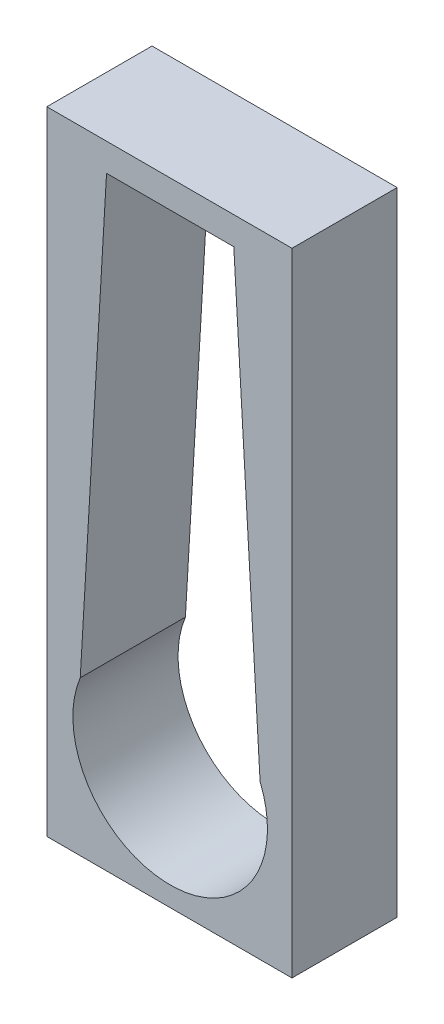
ISO-10303-21;
HEADER;
FILE_DESCRIPTION(('STEP AP214'),'2;1');
FILE_NAME('part.step','',(''),(''),'','','');
FILE_SCHEMA(('AUTOMOTIVE_DESIGN { 1 0 10303 214 1 1 1 1 }'));
ENDSEC;
DATA;
#1=APPLICATION_CONTEXT('core data for automotive mechanical design processes');
#2=APPLICATION_PROTOCOL_DEFINITION('international standard','automotive_design',2000,#1);
#3=PRODUCT_CONTEXT('',#1,'mechanical');
#4=PRODUCT('Part','Part','',(#3));
#5=PRODUCT_RELATED_PRODUCT_CATEGORY('part','',(#4));
#6=PRODUCT_DEFINITION_FORMATION('','',#4);
#7=PRODUCT_DEFINITION_CONTEXT('part definition',#1,'design');
#8=PRODUCT_DEFINITION('design','',#6,#7);
#9=PRODUCT_DEFINITION_SHAPE('','',#8);
#10=(LENGTH_UNIT() NAMED_UNIT(*) SI_UNIT(.MILLI.,.METRE.));
#11=(NAMED_UNIT(*) PLANE_ANGLE_UNIT() SI_UNIT($,.RADIAN.));
#12=(NAMED_UNIT(*) SI_UNIT($,.STERADIAN.) SOLID_ANGLE_UNIT());
#13=UNCERTAINTY_MEASURE_WITH_UNIT(LENGTH_MEASURE(1.E-05),#10,'distance_accuracy_value','');
#14=(GEOMETRIC_REPRESENTATION_CONTEXT(3) GLOBAL_UNCERTAINTY_ASSIGNED_CONTEXT((#13)) GLOBAL_UNIT_ASSIGNED_CONTEXT((#10,
#11,#12)) REPRESENTATION_CONTEXT('',''));
#15=CARTESIAN_POINT('',(0.,0.,0.));
#16=DIRECTION('',(0.,0.,1.));
#17=DIRECTION('',(1.,0.,0.));
#18=AXIS2_PLACEMENT_3D('',#15,#16,#17);
#19=CARTESIAN_POINT('',(0.,0.,4.));
#20=DIRECTION('',(0.,0.,-1.));
#21=DIRECTION('',(-1.,0.,0.));
#22=AXIS2_PLACEMENT_3D('',#19,#20,#21);
#23=PLANE('',#22);
#24=DIRECTION('',(0.,-1.,0.));
#25=VECTOR('',#24,1.);
#26=CARTESIAN_POINT('',(-4.69041686059611,-4.44856408303882,4.));
#27=LINE('',#26,#25);
#28=CARTESIAN_POINT('',(-4.69041686059611,19.587230154749,4.));
#29=VERTEX_POINT('',#28);
#30=CARTESIAN_POINT('',(-4.69041686059611,-4.44856408303882,4.));
#31=VERTEX_POINT('',#30);
#32=EDGE_CURVE('E159',#29,#31,#27,.T.);
#33=ORIENTED_EDGE('',*,*,#32,.T.);
#34=DIRECTION('',(1.,0.,0.));
#35=VECTOR('',#34,1.);
#36=CARTESIAN_POINT('',(-4.69041686059611,-4.44856408303882,4.));
#37=LINE('',#36,#35);
#38=CARTESIAN_POINT('',(4.63307627790522,-4.44856408303882,4.));
#39=VERTEX_POINT('',#38);
#40=EDGE_CURVE('E163',#31,#39,#37,.T.);
#41=ORIENTED_EDGE('',*,*,#40,.T.);
#42=DIRECTION('',(0.,1.,0.));
#43=VECTOR('',#42,1.);
#44=CARTESIAN_POINT('',(4.63307627790522,-4.44856408303882,4.));
#45=LINE('',#44,#43);
#46=CARTESIAN_POINT('',(4.63307627790522,19.587230154749,4.));
#47=VERTEX_POINT('',#46);
#48=EDGE_CURVE('E167',#39,#47,#45,.T.);
#49=ORIENTED_EDGE('',*,*,#48,.T.);
#50=DIRECTION('',(-1.,0.,0.));
#51=VECTOR('',#50,1.);
#52=CARTESIAN_POINT('',(-4.69041686059611,19.587230154749,4.));
#53=LINE('',#52,#51);
#54=EDGE_CURVE('E170',#47,#29,#53,.T.);
#55=ORIENTED_EDGE('',*,*,#54,.T.);
#56=EDGE_LOOP('',(#33,#41,#49,#55));
#57=FACE_BOUND('',#56,.T.);
#58=CARTESIAN_POINT('',(0.,0.,4.));
#59=DIRECTION('',(0.,0.,1.));
#60=DIRECTION('',(1.,0.,0.));
#61=AXIS2_PLACEMENT_3D('',#58,#59,#60);
#62=CIRCLE('',#61,3.7);
#63=CARTESIAN_POINT('',(-3.42,1.41194900757782,4.));
#64=VERTEX_POINT('',#63);
#65=CARTESIAN_POINT('',(3.42,1.41194900757782,4.));
#66=VERTEX_POINT('',#65);
#67=EDGE_CURVE('E111',#64,#66,#62,.T.);
#68=ORIENTED_EDGE('',*,*,#67,.F.);
#69=DIRECTION('',(-0.0583184400996108,-0.998298031423657,0.));
#70=VECTOR('',#69,1.);
#71=CARTESIAN_POINT('',(-2.42,18.53,4.));
#72=LINE('',#71,#70);
#73=CARTESIAN_POINT('',(-2.42,18.53,4.));
#74=VERTEX_POINT('',#73);
#75=EDGE_CURVE('E137',#74,#64,#72,.T.);
#76=ORIENTED_EDGE('',*,*,#75,.F.);
#77=DIRECTION('',(-1.,0.,0.));
#78=VECTOR('',#77,1.);
#79=CARTESIAN_POINT('',(2.42,18.53,4.));
#80=LINE('',#79,#78);
#81=CARTESIAN_POINT('',(2.42,18.53,4.));
#82=VERTEX_POINT('',#81);
#83=EDGE_CURVE('E133',#82,#74,#80,.T.);
#84=ORIENTED_EDGE('',*,*,#83,.F.);
#85=DIRECTION('',(-0.0583184400996108,0.998298031423657,0.));
#86=VECTOR('',#85,1.);
#87=CARTESIAN_POINT('',(3.42,1.41194900757782,4.));
#88=LINE('',#87,#86);
#89=EDGE_CURVE('E120',#66,#82,#88,.T.);
#90=ORIENTED_EDGE('',*,*,#89,.F.);
#91=EDGE_LOOP('',(#68,#76,#84,#90));
#92=FACE_BOUND('',#91,.T.);
#93=ADVANCED_FACE('F45',(#57,#92),#23,.F.);
#94=CARTESIAN_POINT('',(0.,0.,0.));
#95=DIRECTION('',(0.,0.,-1.));
#96=DIRECTION('',(-1.,0.,0.));
#97=AXIS2_PLACEMENT_3D('',#94,#95,#96);
#98=PLANE('',#97);
#99=DIRECTION('',(0.,-1.,0.));
#100=VECTOR('',#99,1.);
#101=CARTESIAN_POINT('',(-4.69041686059611,-4.44856408303882,0.));
#102=LINE('',#101,#100);
#103=CARTESIAN_POINT('',(-4.69041686059611,19.587230154749,0.));
#104=VERTEX_POINT('',#103);
#105=CARTESIAN_POINT('',(-4.69041686059611,-4.44856408303882,0.));
#106=VERTEX_POINT('',#105);
#107=EDGE_CURVE('E129',#104,#106,#102,.T.);
#108=ORIENTED_EDGE('',*,*,#107,.F.);
#109=DIRECTION('',(-1.,0.,0.));
#110=VECTOR('',#109,1.);
#111=CARTESIAN_POINT('',(-4.69041686059611,19.587230154749,0.));
#112=LINE('',#111,#110);
#113=CARTESIAN_POINT('',(4.63307627790522,19.587230154749,0.));
#114=VERTEX_POINT('',#113);
#115=EDGE_CURVE('E164',#114,#104,#112,.T.);
#116=ORIENTED_EDGE('',*,*,#115,.F.);
#117=DIRECTION('',(0.,1.,0.));
#118=VECTOR('',#117,1.);
#119=CARTESIAN_POINT('',(4.63307627790522,-4.44856408303882,0.));
#120=LINE('',#119,#118);
#121=CARTESIAN_POINT('',(4.63307627790522,-4.44856408303882,0.));
#122=VERTEX_POINT('',#121);
#123=EDGE_CURVE('E180',#122,#114,#120,.T.);
#124=ORIENTED_EDGE('',*,*,#123,.F.);
#125=DIRECTION('',(1.,0.,0.));
#126=VECTOR('',#125,1.);
#127=CARTESIAN_POINT('',(-4.69041686059611,-4.44856408303882,0.));
#128=LINE('',#127,#126);
#129=EDGE_CURVE('E177',#106,#122,#128,.T.);
#130=ORIENTED_EDGE('',*,*,#129,.F.);
#131=EDGE_LOOP('',(#108,#116,#124,#130));
#132=FACE_BOUND('',#131,.T.);
#133=DIRECTION('',(-0.0583184400996108,-0.998298031423657,0.));
#134=VECTOR('',#133,1.);
#135=CARTESIAN_POINT('',(-2.42,18.53,0.));
#136=LINE('',#135,#134);
#137=CARTESIAN_POINT('',(-2.42,18.53,0.));
#138=VERTEX_POINT('',#137);
#139=CARTESIAN_POINT('',(-3.42,1.41194900757782,0.));
#140=VERTEX_POINT('',#139);
#141=EDGE_CURVE('E121',#138,#140,#136,.T.);
#142=ORIENTED_EDGE('',*,*,#141,.T.);
#143=CARTESIAN_POINT('',(0.,0.,0.));
#144=DIRECTION('',(0.,0.,1.));
#145=DIRECTION('',(1.,0.,0.));
#146=AXIS2_PLACEMENT_3D('',#143,#144,#145);
#147=CIRCLE('',#146,3.7);
#148=CARTESIAN_POINT('',(3.42,1.41194900757782,0.));
#149=VERTEX_POINT('',#148);
#150=EDGE_CURVE('E69',#140,#149,#147,.T.);
#151=ORIENTED_EDGE('',*,*,#150,.T.);
#152=DIRECTION('',(-0.0583184400996108,0.998298031423657,0.));
#153=VECTOR('',#152,1.);
#154=CARTESIAN_POINT('',(3.42,1.41194900757782,0.));
#155=LINE('',#154,#153);
#156=CARTESIAN_POINT('',(2.42,18.53,0.));
#157=VERTEX_POINT('',#156);
#158=EDGE_CURVE('E127',#149,#157,#155,.T.);
#159=ORIENTED_EDGE('',*,*,#158,.T.);
#160=DIRECTION('',(-1.,0.,0.));
#161=VECTOR('',#160,1.);
#162=CARTESIAN_POINT('',(2.42,18.53,0.));
#163=LINE('',#162,#161);
#164=EDGE_CURVE('E146',#157,#138,#163,.T.);
#165=ORIENTED_EDGE('',*,*,#164,.T.);
#166=EDGE_LOOP('',(#142,#151,#159,#165));
#167=FACE_BOUND('',#166,.T.);
#168=ADVANCED_FACE('F203',(#132,#167),#98,.T.);
#169=CARTESIAN_POINT('',(-4.69041686059611,-4.44856408303882,4.));
#170=DIRECTION('',(1.,0.,0.));
#171=DIRECTION('',(0.,0.,-1.));
#172=AXIS2_PLACEMENT_3D('',#169,#170,#171);
#173=PLANE('',#172);
#174=ORIENTED_EDGE('',*,*,#107,.T.);
#175=DIRECTION('',(0.,0.,-1.));
#176=VECTOR('',#175,1.);
#177=CARTESIAN_POINT('',(-4.69041686059611,-4.44856408303882,4.));
#178=LINE('',#177,#176);
#179=EDGE_CURVE('E11',#31,#106,#178,.T.);
#180=ORIENTED_EDGE('',*,*,#179,.F.);
#181=ORIENTED_EDGE('',*,*,#32,.F.);
#182=DIRECTION('',(0.,0.,-1.));
#183=VECTOR('',#182,1.);
#184=CARTESIAN_POINT('',(-4.69041686059611,19.587230154749,4.));
#185=LINE('',#184,#183);
#186=EDGE_CURVE('E173',#29,#104,#185,.T.);
#187=ORIENTED_EDGE('',*,*,#186,.T.);
#188=EDGE_LOOP('',(#174,#180,#181,#187));
#189=FACE_BOUND('',#188,.T.);
#190=ADVANCED_FACE('F47',(#189),#173,.F.);
#191=CARTESIAN_POINT('',(-4.69041686059611,-4.44856408303882,4.));
#192=DIRECTION('',(0.,1.,0.));
#193=DIRECTION('',(0.,0.,1.));
#194=AXIS2_PLACEMENT_3D('',#191,#192,#193);
#195=PLANE('',#194);
#196=ORIENTED_EDGE('',*,*,#129,.T.);
#197=DIRECTION('',(0.,0.,-1.));
#198=VECTOR('',#197,1.);
#199=CARTESIAN_POINT('',(4.63307627790522,-4.44856408303882,4.));
#200=LINE('',#199,#198);
#201=EDGE_CURVE('E54',#39,#122,#200,.T.);
#202=ORIENTED_EDGE('',*,*,#201,.F.);
#203=ORIENTED_EDGE('',*,*,#40,.F.);
#204=ORIENTED_EDGE('',*,*,#179,.T.);
#205=EDGE_LOOP('',(#196,#202,#203,#204));
#206=FACE_BOUND('',#205,.T.);
#207=ADVANCED_FACE('F213',(#206),#195,.F.);
#208=CARTESIAN_POINT('',(4.63307627790522,-4.44856408303882,4.));
#209=DIRECTION('',(-1.,0.,0.));
#210=DIRECTION('',(0.,0.,1.));
#211=AXIS2_PLACEMENT_3D('',#208,#209,#210);
#212=PLANE('',#211);
#213=ORIENTED_EDGE('',*,*,#123,.T.);
#214=DIRECTION('',(0.,0.,-1.));
#215=VECTOR('',#214,1.);
#216=CARTESIAN_POINT('',(4.63307627790522,19.587230154749,4.));
#217=LINE('',#216,#215);
#218=EDGE_CURVE('E188',#47,#114,#217,.T.);
#219=ORIENTED_EDGE('',*,*,#218,.F.);
#220=ORIENTED_EDGE('',*,*,#48,.F.);
#221=ORIENTED_EDGE('',*,*,#201,.T.);
#222=EDGE_LOOP('',(#213,#219,#220,#221));
#223=FACE_BOUND('',#222,.T.);
#224=ADVANCED_FACE('F197',(#223),#212,.F.);
#225=CARTESIAN_POINT('',(-4.69041686059611,19.587230154749,4.));
#226=DIRECTION('',(0.,-1.,0.));
#227=DIRECTION('',(0.,0.,-1.));
#228=AXIS2_PLACEMENT_3D('',#225,#226,#227);
#229=PLANE('',#228);
#230=ORIENTED_EDGE('',*,*,#115,.T.);
#231=ORIENTED_EDGE('',*,*,#186,.F.);
#232=ORIENTED_EDGE('',*,*,#54,.F.);
#233=ORIENTED_EDGE('',*,*,#218,.T.);
#234=EDGE_LOOP('',(#230,#231,#232,#233));
#235=FACE_BOUND('',#234,.T.);
#236=ADVANCED_FACE('F207',(#235),#229,.F.);
#237=CARTESIAN_POINT('',(0.,0.,4.));
#238=DIRECTION('',(0.,0.,-1.));
#239=DIRECTION('',(-1.,0.,0.));
#240=AXIS2_PLACEMENT_3D('',#237,#238,#239);
#241=CYLINDRICAL_SURFACE('',#240,3.7);
#242=ORIENTED_EDGE('',*,*,#150,.F.);
#243=DIRECTION('',(0.,0.,-1.));
#244=VECTOR('',#243,1.);
#245=CARTESIAN_POINT('',(-3.42,1.41194900757782,4.));
#246=LINE('',#245,#244);
#247=EDGE_CURVE('E115',#64,#140,#246,.T.);
#248=ORIENTED_EDGE('',*,*,#247,.F.);
#249=ORIENTED_EDGE('',*,*,#67,.T.);
#250=DIRECTION('',(0.,0.,-1.));
#251=VECTOR('',#250,1.);
#252=CARTESIAN_POINT('',(3.42,1.41194900757782,4.));
#253=LINE('',#252,#251);
#254=EDGE_CURVE('E114',#66,#149,#253,.T.);
#255=ORIENTED_EDGE('',*,*,#254,.T.);
#256=EDGE_LOOP('',(#242,#248,#249,#255));
#257=FACE_BOUND('',#256,.T.);
#258=ADVANCED_FACE('F113',(#257),#241,.F.);
#259=CARTESIAN_POINT('',(3.42,1.41194900757782,4.));
#260=DIRECTION('',(-0.998298031423657,-0.0583184400996109,0.));
#261=DIRECTION('',(0.0583184400996108,-0.998298031423657,0.));
#262=AXIS2_PLACEMENT_3D('',#259,#260,#261);
#263=PLANE('',#262);
#264=ORIENTED_EDGE('',*,*,#158,.F.);
#265=ORIENTED_EDGE('',*,*,#254,.F.);
#266=ORIENTED_EDGE('',*,*,#89,.T.);
#267=DIRECTION('',(0.,0.,-1.));
#268=VECTOR('',#267,1.);
#269=CARTESIAN_POINT('',(2.42,18.53,4.));
#270=LINE('',#269,#268);
#271=EDGE_CURVE('E130',#82,#157,#270,.T.);
#272=ORIENTED_EDGE('',*,*,#271,.T.);
#273=EDGE_LOOP('',(#264,#265,#266,#272));
#274=FACE_BOUND('',#273,.T.);
#275=ADVANCED_FACE('F124',(#274),#263,.T.);
#276=CARTESIAN_POINT('',(2.42,18.53,4.));
#277=DIRECTION('',(0.,-1.,0.));
#278=DIRECTION('',(0.,0.,-1.));
#279=AXIS2_PLACEMENT_3D('',#276,#277,#278);
#280=PLANE('',#279);
#281=ORIENTED_EDGE('',*,*,#164,.F.);
#282=ORIENTED_EDGE('',*,*,#271,.F.);
#283=ORIENTED_EDGE('',*,*,#83,.T.);
#284=DIRECTION('',(0.,0.,-1.));
#285=VECTOR('',#284,1.);
#286=CARTESIAN_POINT('',(-2.42,18.53,4.));
#287=LINE('',#286,#285);
#288=EDGE_CURVE('E61',#74,#138,#287,.T.);
#289=ORIENTED_EDGE('',*,*,#288,.T.);
#290=EDGE_LOOP('',(#281,#282,#283,#289));
#291=FACE_BOUND('',#290,.T.);
#292=ADVANCED_FACE('F236',(#291),#280,.T.);
#293=CARTESIAN_POINT('',(-2.42,18.53,4.));
#294=DIRECTION('',(0.998298031423657,-0.0583184400996109,0.));
#295=DIRECTION('',(0.0583184400996108,0.998298031423657,0.));
#296=AXIS2_PLACEMENT_3D('',#293,#294,#295);
#297=PLANE('',#296);
#298=ORIENTED_EDGE('',*,*,#141,.F.);
#299=ORIENTED_EDGE('',*,*,#288,.F.);
#300=ORIENTED_EDGE('',*,*,#75,.T.);
#301=ORIENTED_EDGE('',*,*,#247,.T.);
#302=EDGE_LOOP('',(#298,#299,#300,#301));
#303=FACE_BOUND('',#302,.T.);
#304=ADVANCED_FACE('F240',(#303),#297,.T.);
#305=CLOSED_SHELL('',(#93,#168,#190,#207,#224,#236,#258,#275,#292,#304));
#306=MANIFOLD_SOLID_BREP('B2',#305);
#307=ADVANCED_BREP_SHAPE_REPRESENTATION('',(#18,#306),#14);
#308=SHAPE_DEFINITION_REPRESENTATION(#9,#307);
ENDSEC;
END-ISO-10303-21;
